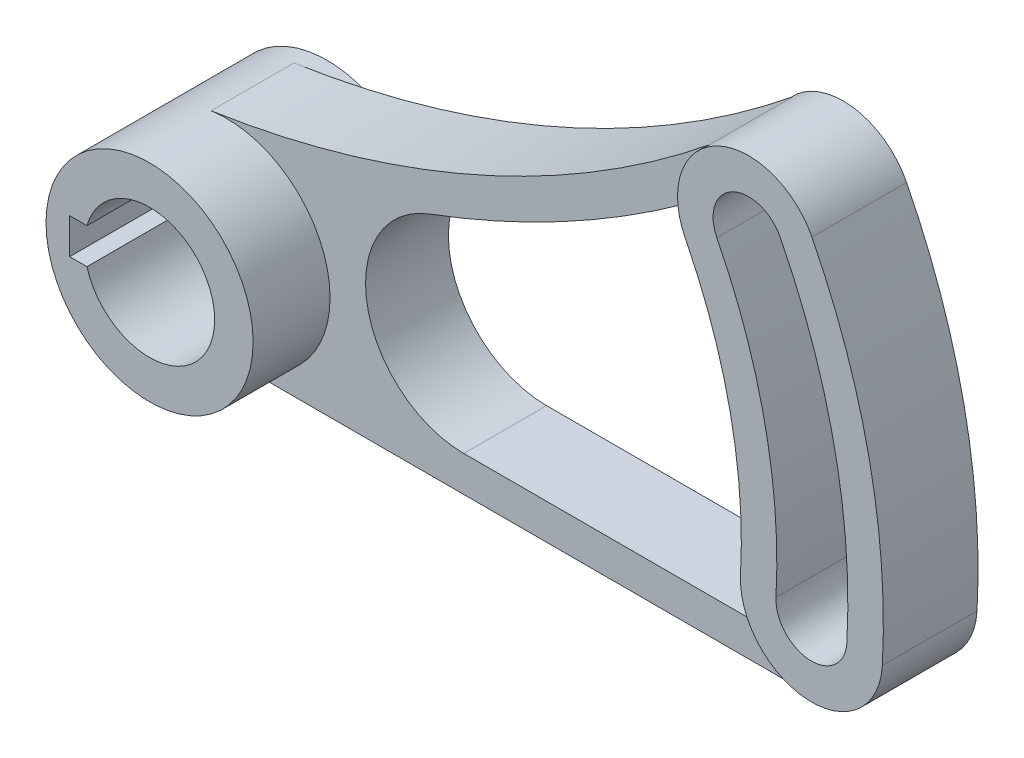
ISO-10303-21;
HEADER;
FILE_DESCRIPTION(('STEP AP214'),'2;1');
FILE_NAME('part.step','',(''),(''),'','','');
FILE_SCHEMA(('AUTOMOTIVE_DESIGN { 1 0 10303 214 1 1 1 1 }'));
ENDSEC;
DATA;
#1=APPLICATION_CONTEXT('core data for automotive mechanical design processes');
#2=APPLICATION_PROTOCOL_DEFINITION('international standard','automotive_design',2000,#1);
#3=PRODUCT_CONTEXT('',#1,'mechanical');
#4=PRODUCT('Part','Part','',(#3));
#5=PRODUCT_RELATED_PRODUCT_CATEGORY('part','',(#4));
#6=PRODUCT_DEFINITION_FORMATION('','',#4);
#7=PRODUCT_DEFINITION_CONTEXT('part definition',#1,'design');
#8=PRODUCT_DEFINITION('design','',#6,#7);
#9=PRODUCT_DEFINITION_SHAPE('','',#8);
#10=(LENGTH_UNIT() NAMED_UNIT(*) SI_UNIT(.MILLI.,.METRE.));
#11=(NAMED_UNIT(*) PLANE_ANGLE_UNIT() SI_UNIT($,.RADIAN.));
#12=(NAMED_UNIT(*) SI_UNIT($,.STERADIAN.) SOLID_ANGLE_UNIT());
#13=UNCERTAINTY_MEASURE_WITH_UNIT(LENGTH_MEASURE(1.E-05),#10,'distance_accuracy_value','');
#14=(GEOMETRIC_REPRESENTATION_CONTEXT(3) GLOBAL_UNCERTAINTY_ASSIGNED_CONTEXT((#13)) GLOBAL_UNIT_ASSIGNED_CONTEXT((#10,
#11,#12)) REPRESENTATION_CONTEXT('',''));
#15=CARTESIAN_POINT('',(0.,0.,0.));
#16=DIRECTION('',(0.,0.,1.));
#17=DIRECTION('',(1.,0.,0.));
#18=AXIS2_PLACEMENT_3D('',#15,#16,#17);
#19=CARTESIAN_POINT('',(0.,0.,30.));
#20=DIRECTION('',(0.,0.,-1.));
#21=DIRECTION('',(-1.,0.,0.));
#22=AXIS2_PLACEMENT_3D('',#19,#20,#21);
#23=CYLINDRICAL_SURFACE('',#22,17.5);
#24=CARTESIAN_POINT('',(0.,0.,0.));
#25=DIRECTION('',(0.,0.,1.));
#26=DIRECTION('',(1.,0.,0.));
#27=AXIS2_PLACEMENT_3D('',#24,#25,#26);
#28=CIRCLE('',#27,17.5);
#29=CARTESIAN_POINT('',(17.5,0.,0.));
#30=VERTEX_POINT('',#29);
#31=EDGE_CURVE('E49',#30,#30,#28,.T.);
#32=ORIENTED_EDGE('',*,*,#31,.T.);
#33=EDGE_LOOP('',(#32));
#34=FACE_BOUND('',#33,.T.);
#35=CARTESIAN_POINT('',(0.,0.,30.));
#36=DIRECTION('',(0.,0.,1.));
#37=DIRECTION('',(1.,0.,0.));
#38=AXIS2_PLACEMENT_3D('',#35,#36,#37);
#39=CIRCLE('',#38,17.5);
#40=CARTESIAN_POINT('',(17.5,0.,30.));
#41=VERTEX_POINT('',#40);
#42=EDGE_CURVE('E11',#41,#41,#39,.T.);
#43=ORIENTED_EDGE('',*,*,#42,.F.);
#44=EDGE_LOOP('',(#43));
#45=FACE_BOUND('',#44,.T.);
#46=DIRECTION('',(0.,0.,-1.));
#47=VECTOR('',#46,1.);
#48=CARTESIAN_POINT('',(0.,-17.5,17.));
#49=LINE('',#48,#47);
#50=CARTESIAN_POINT('',(0.,-17.5,17.));
#51=VERTEX_POINT('',#50);
#52=CARTESIAN_POINT('',(0.,-17.5,3.));
#53=VERTEX_POINT('',#52);
#54=EDGE_CURVE('E65',#51,#53,#49,.T.);
#55=ORIENTED_EDGE('',*,*,#54,.F.);
#56=CARTESIAN_POINT('',(0.,0.,17.));
#57=DIRECTION('',(0.,0.,1.));
#58=DIRECTION('',(1.,0.,0.));
#59=AXIS2_PLACEMENT_3D('',#56,#57,#58);
#60=CIRCLE('',#59,17.5);
#61=CARTESIAN_POINT('',(-2.6015951288117,17.3055396560103,17.));
#62=VERTEX_POINT('',#61);
#63=EDGE_CURVE('E68',#62,#51,#60,.F.);
#64=ORIENTED_EDGE('',*,*,#63,.F.);
#65=DIRECTION('',(0.,0.,-1.));
#66=VECTOR('',#65,1.);
#67=CARTESIAN_POINT('',(-2.6015951288117,17.3055396560103,17.));
#68=LINE('',#67,#66);
#69=CARTESIAN_POINT('',(-2.6015951288117,17.3055396560103,3.));
#70=VERTEX_POINT('',#69);
#71=EDGE_CURVE('E298',#62,#70,#68,.T.);
#72=ORIENTED_EDGE('',*,*,#71,.T.);
#73=CARTESIAN_POINT('',(0.,0.,3.));
#74=DIRECTION('',(0.,0.,1.));
#75=DIRECTION('',(1.,0.,0.));
#76=AXIS2_PLACEMENT_3D('',#73,#74,#75);
#77=CIRCLE('',#76,17.5);
#78=EDGE_CURVE('E252',#70,#53,#77,.F.);
#79=ORIENTED_EDGE('',*,*,#78,.T.);
#80=EDGE_LOOP('',(#55,#64,#72,#79));
#81=FACE_BOUND('',#80,.T.);
#82=ADVANCED_FACE('F50',(#34,#45,#81),#23,.T.);
#83=CARTESIAN_POINT('',(0.,0.,30.));
#84=DIRECTION('',(0.,0.,1.));
#85=DIRECTION('',(1.,0.,0.));
#86=AXIS2_PLACEMENT_3D('',#83,#84,#85);
#87=PLANE('',#86);
#88=ORIENTED_EDGE('',*,*,#42,.T.);
#89=EDGE_LOOP('',(#88));
#90=FACE_BOUND('',#89,.T.);
#91=DIRECTION('',(-1.,0.,0.));
#92=VECTOR('',#91,1.);
#93=CARTESIAN_POINT('',(-10.5830052442584,3.,30.));
#94=LINE('',#93,#92);
#95=CARTESIAN_POINT('',(-10.5830052442584,3.,30.));
#96=VERTEX_POINT('',#95);
#97=CARTESIAN_POINT('',(-13.5,3.,30.));
#98=VERTEX_POINT('',#97);
#99=EDGE_CURVE('E307',#96,#98,#94,.T.);
#100=ORIENTED_EDGE('',*,*,#99,.F.);
#101=CARTESIAN_POINT('',(0.,0.,30.));
#102=DIRECTION('',(0.,0.,1.));
#103=DIRECTION('',(1.,0.,0.));
#104=AXIS2_PLACEMENT_3D('',#101,#102,#103);
#105=CIRCLE('',#104,11.);
#106=CARTESIAN_POINT('',(-10.5830052442584,-3.,30.));
#107=VERTEX_POINT('',#106);
#108=EDGE_CURVE('E305',#107,#96,#105,.T.);
#109=ORIENTED_EDGE('',*,*,#108,.F.);
#110=DIRECTION('',(1.,0.,0.));
#111=VECTOR('',#110,1.);
#112=CARTESIAN_POINT('',(-10.5830052442584,-3.,30.));
#113=LINE('',#112,#111);
#114=CARTESIAN_POINT('',(-13.5,-3.,30.));
#115=VERTEX_POINT('',#114);
#116=EDGE_CURVE('E312',#115,#107,#113,.T.);
#117=ORIENTED_EDGE('',*,*,#116,.F.);
#118=DIRECTION('',(0.,-1.,0.));
#119=VECTOR('',#118,1.);
#120=CARTESIAN_POINT('',(-13.5,3.,30.));
#121=LINE('',#120,#119);
#122=EDGE_CURVE('E313',#98,#115,#121,.T.);
#123=ORIENTED_EDGE('',*,*,#122,.F.);
#124=EDGE_LOOP('',(#100,#109,#117,#123));
#125=FACE_BOUND('',#124,.T.);
#126=ADVANCED_FACE('F359',(#90,#125),#87,.T.);
#127=CARTESIAN_POINT('',(0.,0.,0.));
#128=DIRECTION('',(0.,0.,1.));
#129=DIRECTION('',(1.,0.,0.));
#130=AXIS2_PLACEMENT_3D('',#127,#128,#129);
#131=PLANE('',#130);
#132=ORIENTED_EDGE('',*,*,#31,.F.);
#133=EDGE_LOOP('',(#132));
#134=FACE_BOUND('',#133,.T.);
#135=CARTESIAN_POINT('',(0.,0.,0.));
#136=DIRECTION('',(0.,0.,1.));
#137=DIRECTION('',(1.,0.,0.));
#138=AXIS2_PLACEMENT_3D('',#135,#136,#137);
#139=CIRCLE('',#138,11.);
#140=CARTESIAN_POINT('',(-10.5830052442584,-3.,0.));
#141=VERTEX_POINT('',#140);
#142=CARTESIAN_POINT('',(-10.5830052442584,3.,0.));
#143=VERTEX_POINT('',#142);
#144=EDGE_CURVE('E302',#141,#143,#139,.T.);
#145=ORIENTED_EDGE('',*,*,#144,.T.);
#146=DIRECTION('',(-1.,0.,0.));
#147=VECTOR('',#146,1.);
#148=CARTESIAN_POINT('',(-10.5830052442584,3.,0.));
#149=LINE('',#148,#147);
#150=CARTESIAN_POINT('',(-13.5,3.,0.));
#151=VERTEX_POINT('',#150);
#152=EDGE_CURVE('E325',#143,#151,#149,.T.);
#153=ORIENTED_EDGE('',*,*,#152,.T.);
#154=DIRECTION('',(0.,-1.,0.));
#155=VECTOR('',#154,1.);
#156=CARTESIAN_POINT('',(-13.5,3.,0.));
#157=LINE('',#156,#155);
#158=CARTESIAN_POINT('',(-13.5,-3.,0.));
#159=VERTEX_POINT('',#158);
#160=EDGE_CURVE('E326',#151,#159,#157,.T.);
#161=ORIENTED_EDGE('',*,*,#160,.T.);
#162=DIRECTION('',(1.,0.,0.));
#163=VECTOR('',#162,1.);
#164=CARTESIAN_POINT('',(-10.5830052442584,-3.,0.));
#165=LINE('',#164,#163);
#166=EDGE_CURVE('E306',#159,#141,#165,.T.);
#167=ORIENTED_EDGE('',*,*,#166,.T.);
#168=EDGE_LOOP('',(#145,#153,#161,#167));
#169=FACE_BOUND('',#168,.T.);
#170=ADVANCED_FACE('F354',(#134,#169),#131,.F.);
#171=CARTESIAN_POINT('',(0.,0.,30.));
#172=DIRECTION('',(0.,0.,-1.));
#173=DIRECTION('',(-1.,0.,0.));
#174=AXIS2_PLACEMENT_3D('',#171,#172,#173);
#175=CYLINDRICAL_SURFACE('',#174,11.);
#176=ORIENTED_EDGE('',*,*,#144,.F.);
#177=DIRECTION('',(0.,0.,-1.));
#178=VECTOR('',#177,1.);
#179=CARTESIAN_POINT('',(-10.5830052442584,-3.,30.));
#180=LINE('',#179,#178);
#181=EDGE_CURVE('E318',#107,#141,#180,.T.);
#182=ORIENTED_EDGE('',*,*,#181,.F.);
#183=ORIENTED_EDGE('',*,*,#108,.T.);
#184=DIRECTION('',(0.,0.,-1.));
#185=VECTOR('',#184,1.);
#186=CARTESIAN_POINT('',(-10.5830052442584,3.,30.));
#187=LINE('',#186,#185);
#188=EDGE_CURVE('E344',#96,#143,#187,.T.);
#189=ORIENTED_EDGE('',*,*,#188,.T.);
#190=EDGE_LOOP('',(#176,#182,#183,#189));
#191=FACE_BOUND('',#190,.T.);
#192=ADVANCED_FACE('F358',(#191),#175,.F.);
#193=CARTESIAN_POINT('',(-10.5830052442584,3.,30.));
#194=DIRECTION('',(0.,-1.,0.));
#195=DIRECTION('',(1.,0.,0.));
#196=AXIS2_PLACEMENT_3D('',#193,#194,#195);
#197=PLANE('',#196);
#198=ORIENTED_EDGE('',*,*,#152,.F.);
#199=ORIENTED_EDGE('',*,*,#188,.F.);
#200=ORIENTED_EDGE('',*,*,#99,.T.);
#201=DIRECTION('',(0.,0.,-1.));
#202=VECTOR('',#201,1.);
#203=CARTESIAN_POINT('',(-13.5,3.,30.));
#204=LINE('',#203,#202);
#205=EDGE_CURVE('E336',#98,#151,#204,.T.);
#206=ORIENTED_EDGE('',*,*,#205,.T.);
#207=EDGE_LOOP('',(#198,#199,#200,#206));
#208=FACE_BOUND('',#207,.T.);
#209=ADVANCED_FACE('F366',(#208),#197,.T.);
#210=CARTESIAN_POINT('',(-13.5,3.,30.));
#211=DIRECTION('',(1.,0.,0.));
#212=DIRECTION('',(0.,0.,-1.));
#213=AXIS2_PLACEMENT_3D('',#210,#211,#212);
#214=PLANE('',#213);
#215=ORIENTED_EDGE('',*,*,#160,.F.);
#216=ORIENTED_EDGE('',*,*,#205,.F.);
#217=ORIENTED_EDGE('',*,*,#122,.T.);
#218=DIRECTION('',(0.,0.,-1.));
#219=VECTOR('',#218,1.);
#220=CARTESIAN_POINT('',(-13.5,-3.,30.));
#221=LINE('',#220,#219);
#222=EDGE_CURVE('E337',#115,#159,#221,.T.);
#223=ORIENTED_EDGE('',*,*,#222,.T.);
#224=EDGE_LOOP('',(#215,#216,#217,#223));
#225=FACE_BOUND('',#224,.T.);
#226=ADVANCED_FACE('F375',(#225),#214,.T.);
#227=CARTESIAN_POINT('',(-10.5830052442584,-3.,30.));
#228=DIRECTION('',(0.,1.,0.));
#229=DIRECTION('',(-1.,0.,0.));
#230=AXIS2_PLACEMENT_3D('',#227,#228,#229);
#231=PLANE('',#230);
#232=ORIENTED_EDGE('',*,*,#166,.F.);
#233=ORIENTED_EDGE('',*,*,#222,.F.);
#234=ORIENTED_EDGE('',*,*,#116,.T.);
#235=ORIENTED_EDGE('',*,*,#181,.T.);
#236=EDGE_LOOP('',(#232,#233,#234,#235));
#237=FACE_BOUND('',#236,.T.);
#238=ADVANCED_FACE('F362',(#237),#231,.T.);
#239=CARTESIAN_POINT('',(-28.6175464169289,190.360936216113,17.));
#240=DIRECTION('',(0.,0.,-1.));
#241=DIRECTION('',(-1.,0.,0.));
#242=AXIS2_PLACEMENT_3D('',#239,#240,#241);
#243=CYLINDRICAL_SURFACE('',#242,175.);
#244=CARTESIAN_POINT('',(-28.6175464169289,190.360936216113,3.));
#245=DIRECTION('',(0.,0.,1.));
#246=DIRECTION('',(1.,0.,0.));
#247=AXIS2_PLACEMENT_3D('',#244,#245,#246);
#248=CIRCLE('',#247,175.);
#249=CARTESIAN_POINT('',(81.6595937851613,54.4788095443221,3.));
#250=VERTEX_POINT('',#249);
#251=EDGE_CURVE('E247',#70,#250,#248,.T.);
#252=ORIENTED_EDGE('',*,*,#251,.F.);
#253=ORIENTED_EDGE('',*,*,#71,.F.);
#254=CARTESIAN_POINT('',(-28.6175464169289,190.360936216113,17.));
#255=DIRECTION('',(0.,0.,1.));
#256=DIRECTION('',(1.,0.,0.));
#257=AXIS2_PLACEMENT_3D('',#254,#255,#256);
#258=CIRCLE('',#257,175.);
#259=CARTESIAN_POINT('',(81.6595937851613,54.4788095443221,17.));
#260=VERTEX_POINT('',#259);
#261=EDGE_CURVE('E219',#62,#260,#258,.T.);
#262=ORIENTED_EDGE('',*,*,#261,.T.);
#263=DIRECTION('',(0.,0.,-1.));
#264=VECTOR('',#263,1.);
#265=CARTESIAN_POINT('',(81.6595937851613,54.4788095443221,17.));
#266=LINE('',#265,#264);
#267=EDGE_CURVE('E249',#260,#250,#266,.T.);
#268=ORIENTED_EDGE('',*,*,#267,.T.);
#269=EDGE_LOOP('',(#252,#253,#262,#268));
#270=FACE_BOUND('',#269,.T.);
#271=ADVANCED_FACE('F377',(#270),#243,.F.);
#272=CARTESIAN_POINT('',(0.,-17.5,17.));
#273=DIRECTION('',(0.,1.,0.));
#274=DIRECTION('',(0.,0.,1.));
#275=AXIS2_PLACEMENT_3D('',#272,#273,#274);
#276=PLANE('',#275);
#277=DIRECTION('',(1.,0.,0.));
#278=VECTOR('',#277,1.);
#279=CARTESIAN_POINT('',(0.,-17.5,3.));
#280=LINE('',#279,#278);
#281=CARTESIAN_POINT('',(99.8486354438557,-17.5,3.));
#282=VERTEX_POINT('',#281);
#283=EDGE_CURVE('E258',#53,#282,#280,.T.);
#284=ORIENTED_EDGE('',*,*,#283,.T.);
#285=DIRECTION('',(0.,0.,-1.));
#286=VECTOR('',#285,1.);
#287=CARTESIAN_POINT('',(99.8486354438557,-17.5,17.));
#288=LINE('',#287,#286);
#289=CARTESIAN_POINT('',(99.8486354438557,-17.5,17.));
#290=VERTEX_POINT('',#289);
#291=EDGE_CURVE('E293',#290,#282,#288,.T.);
#292=ORIENTED_EDGE('',*,*,#291,.F.);
#293=DIRECTION('',(1.,0.,0.));
#294=VECTOR('',#293,1.);
#295=CARTESIAN_POINT('',(0.,-17.5,17.));
#296=LINE('',#295,#294);
#297=EDGE_CURVE('E230',#51,#290,#296,.T.);
#298=ORIENTED_EDGE('',*,*,#297,.F.);
#299=ORIENTED_EDGE('',*,*,#54,.T.);
#300=EDGE_LOOP('',(#284,#292,#298,#299));
#301=FACE_BOUND('',#300,.T.);
#302=ADVANCED_FACE('F426',(#301),#276,.F.);
#303=CARTESIAN_POINT('',(0.,-11.5,17.));
#304=DIRECTION('',(0.,-1.,0.));
#305=DIRECTION('',(1.,0.,0.));
#306=AXIS2_PLACEMENT_3D('',#303,#304,#305);
#307=PLANE('',#306);
#308=DIRECTION('',(-1.,0.,0.));
#309=VECTOR('',#308,1.);
#310=CARTESIAN_POINT('',(0.,-11.5,3.));
#311=LINE('',#310,#309);
#312=CARTESIAN_POINT('',(89.4563305984425,-11.5,3.));
#313=VERTEX_POINT('',#312);
#314=CARTESIAN_POINT('',(40.0967462053224,-11.5,3.));
#315=VERTEX_POINT('',#314);
#316=EDGE_CURVE('E262',#313,#315,#311,.T.);
#317=ORIENTED_EDGE('',*,*,#316,.T.);
#318=DIRECTION('',(0.,0.,-1.));
#319=VECTOR('',#318,1.);
#320=CARTESIAN_POINT('',(40.0967462053224,-11.5,17.));
#321=LINE('',#320,#319);
#322=CARTESIAN_POINT('',(40.0967462053224,-11.5,17.));
#323=VERTEX_POINT('',#322);
#324=EDGE_CURVE('E289',#323,#315,#321,.T.);
#325=ORIENTED_EDGE('',*,*,#324,.F.);
#326=DIRECTION('',(-1.,0.,0.));
#327=VECTOR('',#326,1.);
#328=CARTESIAN_POINT('',(0.,-11.5,17.));
#329=LINE('',#328,#327);
#330=CARTESIAN_POINT('',(89.4563305984425,-11.5,17.));
#331=VERTEX_POINT('',#330);
#332=EDGE_CURVE('E235',#331,#323,#329,.T.);
#333=ORIENTED_EDGE('',*,*,#332,.F.);
#334=DIRECTION('',(0.,0.,-1.));
#335=VECTOR('',#334,1.);
#336=CARTESIAN_POINT('',(89.4563305984425,-11.5,17.));
#337=LINE('',#336,#335);
#338=EDGE_CURVE('E292',#331,#313,#337,.T.);
#339=ORIENTED_EDGE('',*,*,#338,.T.);
#340=EDGE_LOOP('',(#317,#325,#333,#339));
#341=FACE_BOUND('',#340,.T.);
#342=ADVANCED_FACE('F436',(#341),#307,.F.);
#343=CARTESIAN_POINT('',(40.0967462053224,5.09674620532238,17.));
#344=DIRECTION('',(0.,0.,-1.));
#345=DIRECTION('',(-1.,0.,0.));
#346=AXIS2_PLACEMENT_3D('',#343,#344,#345);
#347=CYLINDRICAL_SURFACE('',#346,16.5967462053224);
#348=CARTESIAN_POINT('',(40.0967462053224,5.09674620532238,3.));
#349=DIRECTION('',(0.,0.,1.));
#350=DIRECTION('',(1.,0.,0.));
#351=AXIS2_PLACEMENT_3D('',#348,#349,#350);
#352=CIRCLE('',#351,16.5967462053224);
#353=CARTESIAN_POINT('',(34.3252256857248,20.657643849602,3.));
#354=VERTEX_POINT('',#353);
#355=EDGE_CURVE('E270',#315,#354,#352,.F.);
#356=ORIENTED_EDGE('',*,*,#355,.T.);
#357=DIRECTION('',(0.,0.,-1.));
#358=VECTOR('',#357,1.);
#359=CARTESIAN_POINT('',(34.3252256857248,20.657643849602,17.));
#360=LINE('',#359,#358);
#361=CARTESIAN_POINT('',(34.3252256857248,20.657643849602,17.));
#362=VERTEX_POINT('',#361);
#363=EDGE_CURVE('E281',#362,#354,#360,.T.);
#364=ORIENTED_EDGE('',*,*,#363,.F.);
#365=CARTESIAN_POINT('',(40.0967462053224,5.09674620532238,17.));
#366=DIRECTION('',(0.,0.,1.));
#367=DIRECTION('',(1.,0.,0.));
#368=AXIS2_PLACEMENT_3D('',#365,#366,#367);
#369=CIRCLE('',#368,16.5967462053224);
#370=EDGE_CURVE('E240',#323,#362,#369,.F.);
#371=ORIENTED_EDGE('',*,*,#370,.F.);
#372=ORIENTED_EDGE('',*,*,#324,.T.);
#373=EDGE_LOOP('',(#356,#364,#371,#372));
#374=FACE_BOUND('',#373,.T.);
#375=ADVANCED_FACE('F447',(#374),#347,.F.);
#376=CARTESIAN_POINT('',(-28.6175464169289,190.360936216113,17.));
#377=DIRECTION('',(0.,0.,-1.));
#378=DIRECTION('',(-1.,0.,0.));
#379=AXIS2_PLACEMENT_3D('',#376,#377,#378);
#380=CYLINDRICAL_SURFACE('',#379,181.);
#381=CARTESIAN_POINT('',(-28.6175464169289,190.360936216113,3.));
#382=DIRECTION('',(0.,0.,1.));
#383=DIRECTION('',(1.,0.,0.));
#384=AXIS2_PLACEMENT_3D('',#381,#382,#383);
#385=CIRCLE('',#384,181.);
#386=CARTESIAN_POINT('',(77.3229253217045,43.6039382644109,3.));
#387=VERTEX_POINT('',#386);
#388=EDGE_CURVE('E271',#387,#354,#385,.F.);
#389=ORIENTED_EDGE('',*,*,#388,.F.);
#390=DIRECTION('',(0.,0.,-1.));
#391=VECTOR('',#390,1.);
#392=CARTESIAN_POINT('',(77.3229253217045,43.6039382644109,17.));
#393=LINE('',#392,#391);
#394=CARTESIAN_POINT('',(77.3229253217045,43.6039382644109,17.));
#395=VERTEX_POINT('',#394);
#396=EDGE_CURVE('E282',#395,#387,#393,.T.);
#397=ORIENTED_EDGE('',*,*,#396,.F.);
#398=CARTESIAN_POINT('',(-28.6175464169289,190.360936216113,17.));
#399=DIRECTION('',(0.,0.,1.));
#400=DIRECTION('',(1.,0.,0.));
#401=AXIS2_PLACEMENT_3D('',#398,#399,#400);
#402=CIRCLE('',#401,181.);
#403=EDGE_CURVE('E238',#395,#362,#402,.F.);
#404=ORIENTED_EDGE('',*,*,#403,.T.);
#405=ORIENTED_EDGE('',*,*,#363,.T.);
#406=EDGE_LOOP('',(#389,#397,#404,#405));
#407=FACE_BOUND('',#406,.T.);
#408=ADVANCED_FACE('F457',(#407),#380,.T.);
#409=CARTESIAN_POINT('',(0.,0.,17.));
#410=DIRECTION('',(0.,0.,1.));
#411=DIRECTION('',(1.,0.,0.));
#412=AXIS2_PLACEMENT_3D('',#409,#410,#411);
#413=PLANE('',#412);
#414=ORIENTED_EDGE('',*,*,#261,.F.);
#415=ORIENTED_EDGE('',*,*,#63,.T.);
#416=ORIENTED_EDGE('',*,*,#297,.T.);
#417=CARTESIAN_POINT('',(99.8486354438557,-5.50000000000001,17.));
#418=DIRECTION('',(0.,0.,1.));
#419=DIRECTION('',(1.,0.,0.));
#420=AXIS2_PLACEMENT_3D('',#417,#418,#419);
#421=CIRCLE('',#420,12.);
#422=EDGE_CURVE('E233',#331,#290,#421,.T.);
#423=ORIENTED_EDGE('',*,*,#422,.F.);
#424=ORIENTED_EDGE('',*,*,#332,.T.);
#425=ORIENTED_EDGE('',*,*,#370,.T.);
#426=ORIENTED_EDGE('',*,*,#403,.F.);
#427=CARTESIAN_POINT('',(89.2214548275903,45.1611780011136,17.));
#428=DIRECTION('',(0.,0.,1.));
#429=DIRECTION('',(1.,0.,0.));
#430=AXIS2_PLACEMENT_3D('',#427,#428,#429);
#431=CIRCLE('',#430,12.);
#432=EDGE_CURVE('E241',#260,#395,#431,.T.);
#433=ORIENTED_EDGE('',*,*,#432,.F.);
#434=EDGE_LOOP('',(#414,#415,#416,#423,#424,#425,#426,#433));
#435=FACE_BOUND('',#434,.T.);
#436=ADVANCED_FACE('F463',(#435),#413,.T.);
#437=CARTESIAN_POINT('',(0.,0.,3.));
#438=DIRECTION('',(0.,0.,1.));
#439=DIRECTION('',(1.,0.,0.));
#440=AXIS2_PLACEMENT_3D('',#437,#438,#439);
#441=PLANE('',#440);
#442=ORIENTED_EDGE('',*,*,#251,.T.);
#443=CARTESIAN_POINT('',(89.2214548275903,45.1611780011136,3.));
#444=DIRECTION('',(0.,0.,1.));
#445=DIRECTION('',(1.,0.,0.));
#446=AXIS2_PLACEMENT_3D('',#443,#444,#445);
#447=CIRCLE('',#446,12.);
#448=EDGE_CURVE('E221',#250,#387,#447,.T.);
#449=ORIENTED_EDGE('',*,*,#448,.T.);
#450=ORIENTED_EDGE('',*,*,#388,.T.);
#451=ORIENTED_EDGE('',*,*,#355,.F.);
#452=ORIENTED_EDGE('',*,*,#316,.F.);
#453=CARTESIAN_POINT('',(99.8486354438557,-5.50000000000001,3.));
#454=DIRECTION('',(0.,0.,1.));
#455=DIRECTION('',(1.,0.,0.));
#456=AXIS2_PLACEMENT_3D('',#453,#454,#455);
#457=CIRCLE('',#456,12.);
#458=EDGE_CURVE('E257',#313,#282,#457,.T.);
#459=ORIENTED_EDGE('',*,*,#458,.T.);
#460=ORIENTED_EDGE('',*,*,#283,.F.);
#461=ORIENTED_EDGE('',*,*,#78,.F.);
#462=EDGE_LOOP('',(#442,#449,#450,#451,#452,#459,#460,#461));
#463=FACE_BOUND('',#462,.T.);
#464=ADVANCED_FACE('F474',(#463),#441,.F.);
#465=CARTESIAN_POINT('',(99.8486354438557,-5.50000000000001,18.));
#466=DIRECTION('',(0.,0.,-1.));
#467=DIRECTION('',(-1.,0.,0.));
#468=AXIS2_PLACEMENT_3D('',#465,#466,#467);
#469=CYLINDRICAL_SURFACE('',#468,12.);
#470=CARTESIAN_POINT('',(99.8486354438557,-5.50000000000001,2.));
#471=DIRECTION('',(0.,0.,1.));
#472=DIRECTION('',(1.,0.,0.));
#473=AXIS2_PLACEMENT_3D('',#470,#471,#472);
#474=CIRCLE('',#473,12.);
#475=CARTESIAN_POINT('',(87.866799190593,-4.84000000000001,2.));
#476=VERTEX_POINT('',#475);
#477=CARTESIAN_POINT('',(111.830471697118,-6.16000000000001,2.));
#478=VERTEX_POINT('',#477);
#479=EDGE_CURVE('E602',#476,#478,#474,.T.);
#480=ORIENTED_EDGE('',*,*,#479,.T.);
#481=DIRECTION('',(0.,0.,-1.));
#482=VECTOR('',#481,1.);
#483=CARTESIAN_POINT('',(111.830471697118,-6.16000000000001,18.));
#484=LINE('',#483,#482);
#485=CARTESIAN_POINT('',(111.830471697118,-6.16000000000001,18.));
#486=VERTEX_POINT('',#485);
#487=EDGE_CURVE('E216',#486,#478,#484,.T.);
#488=ORIENTED_EDGE('',*,*,#487,.F.);
#489=CARTESIAN_POINT('',(99.8486354438557,-5.50000000000001,18.));
#490=DIRECTION('',(0.,0.,1.));
#491=DIRECTION('',(1.,0.,0.));
#492=AXIS2_PLACEMENT_3D('',#489,#490,#491);
#493=CIRCLE('',#492,12.);
#494=CARTESIAN_POINT('',(87.866799190593,-4.84000000000001,18.));
#495=VERTEX_POINT('',#494);
#496=EDGE_CURVE('E192',#495,#486,#493,.T.);
#497=ORIENTED_EDGE('',*,*,#496,.F.);
#498=DIRECTION('',(0.,0.,-1.));
#499=VECTOR('',#498,1.);
#500=CARTESIAN_POINT('',(87.866799190593,-4.84000000000001,18.));
#501=LINE('',#500,#499);
#502=EDGE_CURVE('E186',#495,#476,#501,.T.);
#503=ORIENTED_EDGE('',*,*,#502,.T.);
#504=EDGE_LOOP('',(#480,#488,#497,#503));
#505=FACE_BOUND('',#504,.T.);
#506=ORIENTED_EDGE('',*,*,#338,.F.);
#507=ORIENTED_EDGE('',*,*,#422,.T.);
#508=ORIENTED_EDGE('',*,*,#291,.T.);
#509=ORIENTED_EDGE('',*,*,#458,.F.);
#510=EDGE_LOOP('',(#506,#507,#508,#509));
#511=FACE_BOUND('',#510,.T.);
#512=ADVANCED_FACE('F484',(#505,#511),#469,.T.);
#513=CARTESIAN_POINT('',(89.2214548275903,45.1611780011136,18.));
#514=DIRECTION('',(0.,0.,-1.));
#515=DIRECTION('',(-1.,0.,0.));
#516=AXIS2_PLACEMENT_3D('',#513,#514,#515);
#517=CYLINDRICAL_SURFACE('',#516,6.);
#518=CARTESIAN_POINT('',(89.2214548275903,45.1611780011136,2.));
#519=DIRECTION('',(0.,0.,1.));
#520=DIRECTION('',(1.,0.,0.));
#521=AXIS2_PLACEMENT_3D('',#518,#519,#520);
#522=CIRCLE('',#521,6.);
#523=CARTESIAN_POINT('',(94.5747421172457,47.8708486811804,2.));
#524=VERTEX_POINT('',#523);
#525=CARTESIAN_POINT('',(83.8681675379349,42.4515073210468,2.));
#526=VERTEX_POINT('',#525);
#527=EDGE_CURVE('E587',#524,#526,#522,.T.);
#528=ORIENTED_EDGE('',*,*,#527,.F.);
#529=DIRECTION('',(0.,0.,-1.));
#530=VECTOR('',#529,1.);
#531=CARTESIAN_POINT('',(94.5747421172457,47.8708486811804,18.));
#532=LINE('',#531,#530);
#533=CARTESIAN_POINT('',(94.5747421172457,47.8708486811804,18.));
#534=VERTEX_POINT('',#533);
#535=EDGE_CURVE('E251',#534,#524,#532,.T.);
#536=ORIENTED_EDGE('',*,*,#535,.F.);
#537=CARTESIAN_POINT('',(89.2214548275903,45.1611780011136,18.));
#538=DIRECTION('',(0.,0.,1.));
#539=DIRECTION('',(1.,0.,0.));
#540=AXIS2_PLACEMENT_3D('',#537,#538,#539);
#541=CIRCLE('',#540,6.);
#542=CARTESIAN_POINT('',(83.8681675379349,42.4515073210468,18.));
#543=VERTEX_POINT('',#542);
#544=EDGE_CURVE('E645',#534,#543,#541,.T.);
#545=ORIENTED_EDGE('',*,*,#544,.T.);
#546=DIRECTION('',(0.,0.,-1.));
#547=VECTOR('',#546,1.);
#548=CARTESIAN_POINT('',(83.8681675379349,42.4515073210468,18.));
#549=LINE('',#548,#547);
#550=EDGE_CURVE('E209',#543,#526,#549,.T.);
#551=ORIENTED_EDGE('',*,*,#550,.T.);
#552=EDGE_LOOP('',(#528,#536,#545,#551));
#553=FACE_BOUND('',#552,.T.);
#554=ADVANCED_FACE('F494',(#553),#517,.F.);
#555=CARTESIAN_POINT('',(0.,0.,18.));
#556=DIRECTION('',(0.,0.,-1.));
#557=DIRECTION('',(-1.,0.,0.));
#558=AXIS2_PLACEMENT_3D('',#555,#556,#557);
#559=CYLINDRICAL_SURFACE('',#558,106.);
#560=CARTESIAN_POINT('',(0.,0.,2.));
#561=DIRECTION('',(0.,0.,1.));
#562=DIRECTION('',(1.,0.,0.));
#563=AXIS2_PLACEMENT_3D('',#560,#561,#562);
#564=CIRCLE('',#563,106.);
#565=CARTESIAN_POINT('',(105.839553570487,-5.83000000000001,2.));
#566=VERTEX_POINT('',#565);
#567=EDGE_CURVE('E594',#524,#566,#564,.F.);
#568=ORIENTED_EDGE('',*,*,#567,.T.);
#569=DIRECTION('',(0.,0.,-1.));
#570=VECTOR('',#569,1.);
#571=CARTESIAN_POINT('',(105.839553570487,-5.83000000000001,18.));
#572=LINE('',#571,#570);
#573=CARTESIAN_POINT('',(105.839553570487,-5.83000000000001,18.));
#574=VERTEX_POINT('',#573);
#575=EDGE_CURVE('E614',#574,#566,#572,.T.);
#576=ORIENTED_EDGE('',*,*,#575,.F.);
#577=CARTESIAN_POINT('',(0.,0.,18.));
#578=DIRECTION('',(0.,0.,1.));
#579=DIRECTION('',(1.,0.,0.));
#580=AXIS2_PLACEMENT_3D('',#577,#578,#579);
#581=CIRCLE('',#580,106.);
#582=EDGE_CURVE('E640',#534,#574,#581,.F.);
#583=ORIENTED_EDGE('',*,*,#582,.F.);
#584=ORIENTED_EDGE('',*,*,#535,.T.);
#585=EDGE_LOOP('',(#568,#576,#583,#584));
#586=FACE_BOUND('',#585,.T.);
#587=ADVANCED_FACE('F503',(#586),#559,.F.);
#588=CARTESIAN_POINT('',(99.8486354438557,-5.50000000000001,18.));
#589=DIRECTION('',(0.,0.,-1.));
#590=DIRECTION('',(-1.,0.,0.));
#591=AXIS2_PLACEMENT_3D('',#588,#589,#590);
#592=CYLINDRICAL_SURFACE('',#591,6.);
#593=CARTESIAN_POINT('',(99.8486354438557,-5.50000000000001,2.));
#594=DIRECTION('',(0.,0.,1.));
#595=DIRECTION('',(1.,0.,0.));
#596=AXIS2_PLACEMENT_3D('',#593,#594,#595);
#597=CIRCLE('',#596,6.);
#598=CARTESIAN_POINT('',(93.8577173172244,-5.17,2.));
#599=VERTEX_POINT('',#598);
#600=EDGE_CURVE('E601',#599,#566,#597,.T.);
#601=ORIENTED_EDGE('',*,*,#600,.F.);
#602=DIRECTION('',(0.,0.,-1.));
#603=VECTOR('',#602,1.);
#604=CARTESIAN_POINT('',(93.8577173172244,-5.17,18.));
#605=LINE('',#604,#603);
#606=CARTESIAN_POINT('',(93.8577173172244,-5.17,18.));
#607=VERTEX_POINT('',#606);
#608=EDGE_CURVE('E212',#607,#599,#605,.T.);
#609=ORIENTED_EDGE('',*,*,#608,.F.);
#610=CARTESIAN_POINT('',(99.8486354438557,-5.50000000000001,18.));
#611=DIRECTION('',(0.,0.,1.));
#612=DIRECTION('',(1.,0.,0.));
#613=AXIS2_PLACEMENT_3D('',#610,#611,#612);
#614=CIRCLE('',#613,6.);
#615=EDGE_CURVE('E631',#607,#574,#614,.T.);
#616=ORIENTED_EDGE('',*,*,#615,.T.);
#617=ORIENTED_EDGE('',*,*,#575,.T.);
#618=EDGE_LOOP('',(#601,#609,#616,#617));
#619=FACE_BOUND('',#618,.T.);
#620=ADVANCED_FACE('F513',(#619),#592,.F.);
#621=CARTESIAN_POINT('',(89.2214548275903,45.1611780011136,18.));
#622=DIRECTION('',(0.,0.,-1.));
#623=DIRECTION('',(-1.,0.,0.));
#624=AXIS2_PLACEMENT_3D('',#621,#622,#623);
#625=CYLINDRICAL_SURFACE('',#624,12.);
#626=ORIENTED_EDGE('',*,*,#432,.T.);
#627=ORIENTED_EDGE('',*,*,#396,.T.);
#628=ORIENTED_EDGE('',*,*,#448,.F.);
#629=ORIENTED_EDGE('',*,*,#267,.F.);
#630=EDGE_LOOP('',(#626,#627,#628,#629));
#631=FACE_BOUND('',#630,.T.);
#632=CARTESIAN_POINT('',(89.2214548275903,45.1611780011136,2.));
#633=DIRECTION('',(0.,0.,1.));
#634=DIRECTION('',(1.,0.,0.));
#635=AXIS2_PLACEMENT_3D('',#632,#633,#634);
#636=CIRCLE('',#635,12.);
#637=CARTESIAN_POINT('',(99.9280294069011,50.5805193612472,2.));
#638=VERTEX_POINT('',#637);
#639=CARTESIAN_POINT('',(78.5148802482795,39.7418366409799,2.));
#640=VERTEX_POINT('',#639);
#641=EDGE_CURVE('E208',#638,#640,#636,.T.);
#642=ORIENTED_EDGE('',*,*,#641,.T.);
#643=DIRECTION('',(0.,0.,-1.));
#644=VECTOR('',#643,1.);
#645=CARTESIAN_POINT('',(78.5148802482795,39.7418366409799,18.));
#646=LINE('',#645,#644);
#647=CARTESIAN_POINT('',(78.5148802482795,39.7418366409799,18.));
#648=VERTEX_POINT('',#647);
#649=EDGE_CURVE('E187',#648,#640,#646,.T.);
#650=ORIENTED_EDGE('',*,*,#649,.F.);
#651=CARTESIAN_POINT('',(89.2214548275903,45.1611780011136,18.));
#652=DIRECTION('',(0.,0.,1.));
#653=DIRECTION('',(1.,0.,0.));
#654=AXIS2_PLACEMENT_3D('',#651,#652,#653);
#655=CIRCLE('',#654,12.);
#656=CARTESIAN_POINT('',(99.9280294069011,50.5805193612472,18.));
#657=VERTEX_POINT('',#656);
#658=EDGE_CURVE('E195',#657,#648,#655,.T.);
#659=ORIENTED_EDGE('',*,*,#658,.F.);
#660=DIRECTION('',(0.,0.,-1.));
#661=VECTOR('',#660,1.);
#662=CARTESIAN_POINT('',(99.9280294069011,50.5805193612472,18.));
#663=LINE('',#662,#661);
#664=EDGE_CURVE('E617',#657,#638,#663,.T.);
#665=ORIENTED_EDGE('',*,*,#664,.T.);
#666=EDGE_LOOP('',(#642,#650,#659,#665));
#667=FACE_BOUND('',#666,.T.);
#668=ADVANCED_FACE('F206',(#631,#667),#625,.T.);
#669=CARTESIAN_POINT('',(0.,0.,18.));
#670=DIRECTION('',(0.,0.,-1.));
#671=DIRECTION('',(-1.,0.,0.));
#672=AXIS2_PLACEMENT_3D('',#669,#670,#671);
#673=CYLINDRICAL_SURFACE('',#672,88.);
#674=CARTESIAN_POINT('',(0.,0.,2.));
#675=DIRECTION('',(0.,0.,1.));
#676=DIRECTION('',(1.,0.,0.));
#677=AXIS2_PLACEMENT_3D('',#674,#675,#676);
#678=CIRCLE('',#677,88.);
#679=EDGE_CURVE('E630',#640,#476,#678,.F.);
#680=ORIENTED_EDGE('',*,*,#679,.T.);
#681=ORIENTED_EDGE('',*,*,#502,.F.);
#682=CARTESIAN_POINT('',(0.,0.,18.));
#683=DIRECTION('',(0.,0.,1.));
#684=DIRECTION('',(1.,0.,0.));
#685=AXIS2_PLACEMENT_3D('',#682,#683,#684);
#686=CIRCLE('',#685,88.);
#687=EDGE_CURVE('E185',#648,#495,#686,.F.);
#688=ORIENTED_EDGE('',*,*,#687,.F.);
#689=ORIENTED_EDGE('',*,*,#649,.T.);
#690=EDGE_LOOP('',(#680,#681,#688,#689));
#691=FACE_BOUND('',#690,.T.);
#692=ADVANCED_FACE('F184',(#691),#673,.F.);
#693=CARTESIAN_POINT('',(0.,0.,18.));
#694=DIRECTION('',(0.,0.,-1.));
#695=DIRECTION('',(-1.,0.,0.));
#696=AXIS2_PLACEMENT_3D('',#693,#694,#695);
#697=CYLINDRICAL_SURFACE('',#696,112.);
#698=CARTESIAN_POINT('',(0.,0.,2.));
#699=DIRECTION('',(0.,0.,1.));
#700=DIRECTION('',(1.,0.,0.));
#701=AXIS2_PLACEMENT_3D('',#698,#699,#700);
#702=CIRCLE('',#701,112.);
#703=EDGE_CURVE('E600',#638,#478,#702,.F.);
#704=ORIENTED_EDGE('',*,*,#703,.F.);
#705=ORIENTED_EDGE('',*,*,#664,.F.);
#706=CARTESIAN_POINT('',(0.,0.,18.));
#707=DIRECTION('',(0.,0.,1.));
#708=DIRECTION('',(1.,0.,0.));
#709=AXIS2_PLACEMENT_3D('',#706,#707,#708);
#710=CIRCLE('',#709,112.);
#711=EDGE_CURVE('E203',#657,#486,#710,.F.);
#712=ORIENTED_EDGE('',*,*,#711,.T.);
#713=ORIENTED_EDGE('',*,*,#487,.T.);
#714=EDGE_LOOP('',(#704,#705,#712,#713));
#715=FACE_BOUND('',#714,.T.);
#716=ADVANCED_FACE('F543',(#715),#697,.T.);
#717=CARTESIAN_POINT('',(0.,0.,18.));
#718=DIRECTION('',(0.,0.,-1.));
#719=DIRECTION('',(-1.,0.,0.));
#720=AXIS2_PLACEMENT_3D('',#717,#718,#719);
#721=CYLINDRICAL_SURFACE('',#720,94.);
#722=CARTESIAN_POINT('',(0.,0.,2.));
#723=DIRECTION('',(0.,0.,1.));
#724=DIRECTION('',(1.,0.,0.));
#725=AXIS2_PLACEMENT_3D('',#722,#723,#724);
#726=CIRCLE('',#725,94.);
#727=EDGE_CURVE('E204',#599,#526,#726,.T.);
#728=ORIENTED_EDGE('',*,*,#727,.T.);
#729=ORIENTED_EDGE('',*,*,#550,.F.);
#730=CARTESIAN_POINT('',(0.,0.,18.));
#731=DIRECTION('',(0.,0.,1.));
#732=DIRECTION('',(1.,0.,0.));
#733=AXIS2_PLACEMENT_3D('',#730,#731,#732);
#734=CIRCLE('',#733,94.);
#735=EDGE_CURVE('E616',#607,#543,#734,.T.);
#736=ORIENTED_EDGE('',*,*,#735,.F.);
#737=ORIENTED_EDGE('',*,*,#608,.T.);
#738=EDGE_LOOP('',(#728,#729,#736,#737));
#739=FACE_BOUND('',#738,.T.);
#740=ADVANCED_FACE('F555',(#739),#721,.T.);
#741=CARTESIAN_POINT('',(0.,0.,18.));
#742=DIRECTION('',(0.,0.,1.));
#743=DIRECTION('',(1.,0.,0.));
#744=AXIS2_PLACEMENT_3D('',#741,#742,#743);
#745=PLANE('',#744);
#746=ORIENTED_EDGE('',*,*,#658,.T.);
#747=ORIENTED_EDGE('',*,*,#687,.T.);
#748=ORIENTED_EDGE('',*,*,#496,.T.);
#749=ORIENTED_EDGE('',*,*,#711,.F.);
#750=EDGE_LOOP('',(#746,#747,#748,#749));
#751=FACE_BOUND('',#750,.T.);
#752=ORIENTED_EDGE('',*,*,#544,.F.);
#753=ORIENTED_EDGE('',*,*,#582,.T.);
#754=ORIENTED_EDGE('',*,*,#615,.F.);
#755=ORIENTED_EDGE('',*,*,#735,.T.);
#756=EDGE_LOOP('',(#752,#753,#754,#755));
#757=FACE_BOUND('',#756,.T.);
#758=ADVANCED_FACE('F196',(#751,#757),#745,.T.);
#759=CARTESIAN_POINT('',(0.,0.,2.));
#760=DIRECTION('',(0.,0.,1.));
#761=DIRECTION('',(1.,0.,0.));
#762=AXIS2_PLACEMENT_3D('',#759,#760,#761);
#763=PLANE('',#762);
#764=ORIENTED_EDGE('',*,*,#641,.F.);
#765=ORIENTED_EDGE('',*,*,#703,.T.);
#766=ORIENTED_EDGE('',*,*,#479,.F.);
#767=ORIENTED_EDGE('',*,*,#679,.F.);
#768=EDGE_LOOP('',(#764,#765,#766,#767));
#769=FACE_BOUND('',#768,.T.);
#770=ORIENTED_EDGE('',*,*,#527,.T.);
#771=ORIENTED_EDGE('',*,*,#727,.F.);
#772=ORIENTED_EDGE('',*,*,#600,.T.);
#773=ORIENTED_EDGE('',*,*,#567,.F.);
#774=EDGE_LOOP('',(#770,#771,#772,#773));
#775=FACE_BOUND('',#774,.T.);
#776=ADVANCED_FACE('F572',(#769,#775),#763,.F.);
#777=CLOSED_SHELL('',(#82,#126,#170,#192,#209,#226,#238,#271,#302,#342,#375,#408,#436,#464,#512,
#554,#587,#620,#668,#692,#716,#740,#758,#776));
#778=MANIFOLD_SOLID_BREP('B2',#777);
#779=ADVANCED_BREP_SHAPE_REPRESENTATION('',(#18,#778),#14);
#780=SHAPE_DEFINITION_REPRESENTATION(#9,#779);
ENDSEC;
END-ISO-10303-21;
